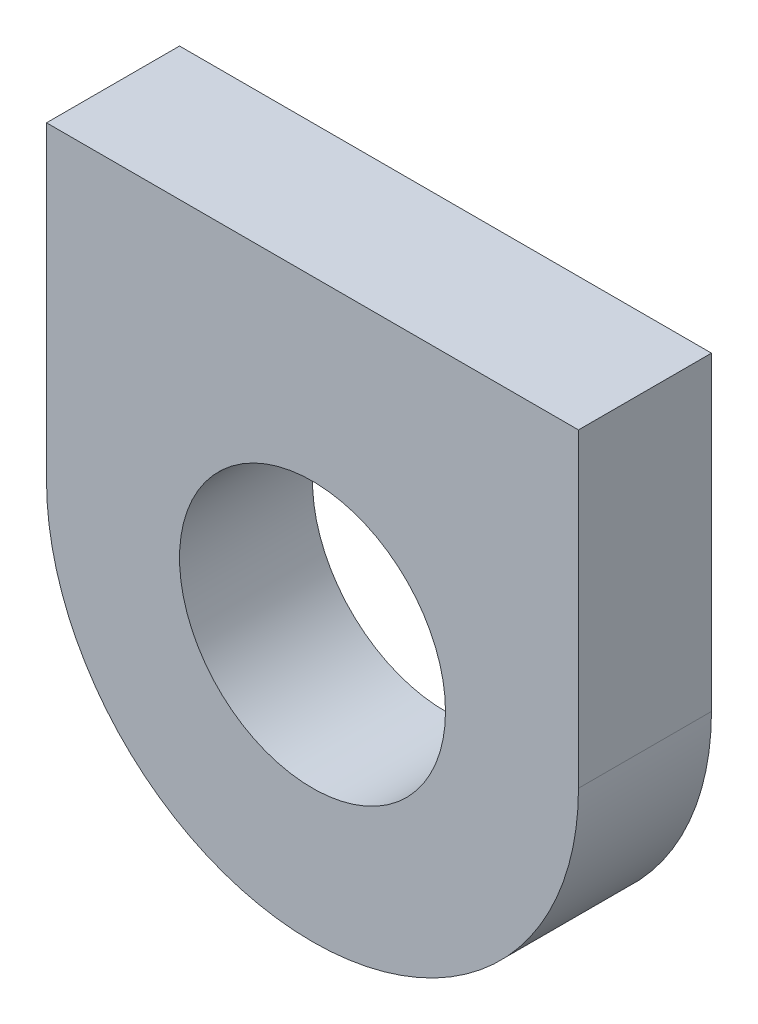
ISO-10303-21;
HEADER;
FILE_DESCRIPTION(('STEP AP214'),'2;1');
FILE_NAME('part.step','',(''),(''),'','','');
FILE_SCHEMA(('AUTOMOTIVE_DESIGN { 1 0 10303 214 1 1 1 1 }'));
ENDSEC;
DATA;
#1=APPLICATION_CONTEXT('core data for automotive mechanical design processes');
#2=APPLICATION_PROTOCOL_DEFINITION('international standard','automotive_design',2000,#1);
#3=PRODUCT_CONTEXT('',#1,'mechanical');
#4=PRODUCT('Part','Part','',(#3));
#5=PRODUCT_RELATED_PRODUCT_CATEGORY('part','',(#4));
#6=PRODUCT_DEFINITION_FORMATION('','',#4);
#7=PRODUCT_DEFINITION_CONTEXT('part definition',#1,'design');
#8=PRODUCT_DEFINITION('design','',#6,#7);
#9=PRODUCT_DEFINITION_SHAPE('','',#8);
#10=(LENGTH_UNIT() NAMED_UNIT(*) SI_UNIT(.MILLI.,.METRE.));
#11=(NAMED_UNIT(*) PLANE_ANGLE_UNIT() SI_UNIT($,.RADIAN.));
#12=(NAMED_UNIT(*) SI_UNIT($,.STERADIAN.) SOLID_ANGLE_UNIT());
#13=UNCERTAINTY_MEASURE_WITH_UNIT(LENGTH_MEASURE(1.E-05),#10,'distance_accuracy_value','');
#14=(GEOMETRIC_REPRESENTATION_CONTEXT(3) GLOBAL_UNCERTAINTY_ASSIGNED_CONTEXT((#13)) GLOBAL_UNIT_ASSIGNED_CONTEXT((#10,
#11,#12)) REPRESENTATION_CONTEXT('',''));
#15=CARTESIAN_POINT('',(0.,0.,0.));
#16=DIRECTION('',(0.,0.,1.));
#17=DIRECTION('',(1.,0.,0.));
#18=AXIS2_PLACEMENT_3D('',#15,#16,#17);
#19=CARTESIAN_POINT('',(0.,0.,15.));
#20=DIRECTION('',(0.,0.,1.));
#21=DIRECTION('',(1.,0.,0.));
#22=AXIS2_PLACEMENT_3D('',#19,#20,#21);
#23=PLANE('',#22);
#24=CARTESIAN_POINT('',(0.,0.,15.));
#25=DIRECTION('',(0.,0.,1.));
#26=DIRECTION('',(1.,0.,0.));
#27=AXIS2_PLACEMENT_3D('',#24,#25,#26);
#28=CIRCLE('',#27,30.);
#29=CARTESIAN_POINT('',(-30.,0.,15.));
#30=VERTEX_POINT('',#29);
#31=CARTESIAN_POINT('',(30.,0.,15.));
#32=VERTEX_POINT('',#31);
#33=EDGE_CURVE('E85',#30,#32,#28,.T.);
#34=ORIENTED_EDGE('',*,*,#33,.T.);
#35=DIRECTION('',(0.,1.,0.));
#36=VECTOR('',#35,1.);
#37=CARTESIAN_POINT('',(30.,35.,15.));
#38=LINE('',#37,#36);
#39=CARTESIAN_POINT('',(30.,35.,15.));
#40=VERTEX_POINT('',#39);
#41=EDGE_CURVE('E80',#32,#40,#38,.T.);
#42=ORIENTED_EDGE('',*,*,#41,.T.);
#43=DIRECTION('',(-1.,0.,0.));
#44=VECTOR('',#43,1.);
#45=CARTESIAN_POINT('',(-30.,35.,15.));
#46=LINE('',#45,#44);
#47=CARTESIAN_POINT('',(-30.,35.,15.));
#48=VERTEX_POINT('',#47);
#49=EDGE_CURVE('E83',#40,#48,#46,.T.);
#50=ORIENTED_EDGE('',*,*,#49,.T.);
#51=DIRECTION('',(0.,-1.,0.));
#52=VECTOR('',#51,1.);
#53=CARTESIAN_POINT('',(-30.,0.,15.));
#54=LINE('',#53,#52);
#55=EDGE_CURVE('E50',#48,#30,#54,.T.);
#56=ORIENTED_EDGE('',*,*,#55,.T.);
#57=EDGE_LOOP('',(#34,#42,#50,#56));
#58=FACE_BOUND('',#57,.T.);
#59=CARTESIAN_POINT('',(0.,0.,15.));
#60=DIRECTION('',(0.,0.,1.));
#61=DIRECTION('',(1.,0.,0.));
#62=AXIS2_PLACEMENT_3D('',#59,#60,#61);
#63=CIRCLE('',#62,15.);
#64=CARTESIAN_POINT('',(15.,0.,15.));
#65=VERTEX_POINT('',#64);
#66=EDGE_CURVE('E100',#65,#65,#63,.T.);
#67=ORIENTED_EDGE('',*,*,#66,.F.);
#68=EDGE_LOOP('',(#67));
#69=FACE_BOUND('',#68,.T.);
#70=ADVANCED_FACE('F33',(#58,#69),#23,.T.);
#71=CARTESIAN_POINT('',(0.,0.,0.));
#72=DIRECTION('',(0.,0.,1.));
#73=DIRECTION('',(1.,0.,0.));
#74=AXIS2_PLACEMENT_3D('',#71,#72,#73);
#75=PLANE('',#74);
#76=CARTESIAN_POINT('',(0.,0.,0.));
#77=DIRECTION('',(0.,0.,1.));
#78=DIRECTION('',(1.,0.,0.));
#79=AXIS2_PLACEMENT_3D('',#76,#77,#78);
#80=CIRCLE('',#79,30.);
#81=CARTESIAN_POINT('',(-30.,0.,0.));
#82=VERTEX_POINT('',#81);
#83=CARTESIAN_POINT('',(30.,0.,0.));
#84=VERTEX_POINT('',#83);
#85=EDGE_CURVE('E97',#82,#84,#80,.T.);
#86=ORIENTED_EDGE('',*,*,#85,.F.);
#87=DIRECTION('',(0.,-1.,0.));
#88=VECTOR('',#87,1.);
#89=CARTESIAN_POINT('',(-30.,0.,0.));
#90=LINE('',#89,#88);
#91=CARTESIAN_POINT('',(-30.,35.,0.));
#92=VERTEX_POINT('',#91);
#93=EDGE_CURVE('E73',#92,#82,#90,.T.);
#94=ORIENTED_EDGE('',*,*,#93,.F.);
#95=DIRECTION('',(-1.,0.,0.));
#96=VECTOR('',#95,1.);
#97=CARTESIAN_POINT('',(-30.,35.,0.));
#98=LINE('',#97,#96);
#99=CARTESIAN_POINT('',(30.,35.,0.));
#100=VERTEX_POINT('',#99);
#101=EDGE_CURVE('E67',#100,#92,#98,.T.);
#102=ORIENTED_EDGE('',*,*,#101,.F.);
#103=DIRECTION('',(0.,1.,0.));
#104=VECTOR('',#103,1.);
#105=CARTESIAN_POINT('',(30.,35.,0.));
#106=LINE('',#105,#104);
#107=EDGE_CURVE('E89',#84,#100,#106,.T.);
#108=ORIENTED_EDGE('',*,*,#107,.F.);
#109=EDGE_LOOP('',(#86,#94,#102,#108));
#110=FACE_BOUND('',#109,.T.);
#111=CARTESIAN_POINT('',(0.,0.,0.));
#112=DIRECTION('',(0.,0.,1.));
#113=DIRECTION('',(1.,0.,0.));
#114=AXIS2_PLACEMENT_3D('',#111,#112,#113);
#115=CIRCLE('',#114,15.);
#116=CARTESIAN_POINT('',(15.,0.,0.));
#117=VERTEX_POINT('',#116);
#118=EDGE_CURVE('E112',#117,#117,#115,.T.);
#119=ORIENTED_EDGE('',*,*,#118,.T.);
#120=EDGE_LOOP('',(#119));
#121=FACE_BOUND('',#120,.T.);
#122=ADVANCED_FACE('F108',(#110,#121),#75,.F.);
#123=CARTESIAN_POINT('',(0.,0.,15.));
#124=DIRECTION('',(0.,0.,-1.));
#125=DIRECTION('',(-1.,0.,0.));
#126=AXIS2_PLACEMENT_3D('',#123,#124,#125);
#127=CYLINDRICAL_SURFACE('',#126,30.);
#128=ORIENTED_EDGE('',*,*,#85,.T.);
#129=DIRECTION('',(0.,0.,-1.));
#130=VECTOR('',#129,1.);
#131=CARTESIAN_POINT('',(30.,0.,15.));
#132=LINE('',#131,#130);
#133=EDGE_CURVE('E11',#32,#84,#132,.T.);
#134=ORIENTED_EDGE('',*,*,#133,.F.);
#135=ORIENTED_EDGE('',*,*,#33,.F.);
#136=DIRECTION('',(0.,0.,-1.));
#137=VECTOR('',#136,1.);
#138=CARTESIAN_POINT('',(-30.,0.,15.));
#139=LINE('',#138,#137);
#140=EDGE_CURVE('E93',#30,#82,#139,.T.);
#141=ORIENTED_EDGE('',*,*,#140,.T.);
#142=EDGE_LOOP('',(#128,#134,#135,#141));
#143=FACE_BOUND('',#142,.T.);
#144=ADVANCED_FACE('F35',(#143),#127,.T.);
#145=CARTESIAN_POINT('',(30.,35.,15.));
#146=DIRECTION('',(-1.,0.,0.));
#147=DIRECTION('',(0.,0.,1.));
#148=AXIS2_PLACEMENT_3D('',#145,#146,#147);
#149=PLANE('',#148);
#150=ORIENTED_EDGE('',*,*,#107,.T.);
#151=DIRECTION('',(0.,0.,-1.));
#152=VECTOR('',#151,1.);
#153=CARTESIAN_POINT('',(30.,35.,15.));
#154=LINE('',#153,#152);
#155=EDGE_CURVE('E42',#40,#100,#154,.T.);
#156=ORIENTED_EDGE('',*,*,#155,.F.);
#157=ORIENTED_EDGE('',*,*,#41,.F.);
#158=ORIENTED_EDGE('',*,*,#133,.T.);
#159=EDGE_LOOP('',(#150,#156,#157,#158));
#160=FACE_BOUND('',#159,.T.);
#161=ADVANCED_FACE('F88',(#160),#149,.F.);
#162=CARTESIAN_POINT('',(-30.,35.,15.));
#163=DIRECTION('',(0.,-1.,0.));
#164=DIRECTION('',(0.,0.,-1.));
#165=AXIS2_PLACEMENT_3D('',#162,#163,#164);
#166=PLANE('',#165);
#167=ORIENTED_EDGE('',*,*,#101,.T.);
#168=DIRECTION('',(0.,0.,-1.));
#169=VECTOR('',#168,1.);
#170=CARTESIAN_POINT('',(-30.,35.,15.));
#171=LINE('',#170,#169);
#172=EDGE_CURVE('E90',#48,#92,#171,.T.);
#173=ORIENTED_EDGE('',*,*,#172,.F.);
#174=ORIENTED_EDGE('',*,*,#49,.F.);
#175=ORIENTED_EDGE('',*,*,#155,.T.);
#176=EDGE_LOOP('',(#167,#173,#174,#175));
#177=FACE_BOUND('',#176,.T.);
#178=ADVANCED_FACE('F91',(#177),#166,.F.);
#179=CARTESIAN_POINT('',(-30.,0.,15.));
#180=DIRECTION('',(1.,0.,0.));
#181=DIRECTION('',(0.,0.,-1.));
#182=AXIS2_PLACEMENT_3D('',#179,#180,#181);
#183=PLANE('',#182);
#184=ORIENTED_EDGE('',*,*,#93,.T.);
#185=ORIENTED_EDGE('',*,*,#140,.F.);
#186=ORIENTED_EDGE('',*,*,#55,.F.);
#187=ORIENTED_EDGE('',*,*,#172,.T.);
#188=EDGE_LOOP('',(#184,#185,#186,#187));
#189=FACE_BOUND('',#188,.T.);
#190=ADVANCED_FACE('F105',(#189),#183,.F.);
#191=CARTESIAN_POINT('',(0.,0.,15.));
#192=DIRECTION('',(0.,0.,-1.));
#193=DIRECTION('',(-1.,0.,0.));
#194=AXIS2_PLACEMENT_3D('',#191,#192,#193);
#195=CYLINDRICAL_SURFACE('',#194,15.);
#196=ORIENTED_EDGE('',*,*,#66,.T.);
#197=EDGE_LOOP('',(#196));
#198=FACE_BOUND('',#197,.T.);
#199=ORIENTED_EDGE('',*,*,#118,.F.);
#200=EDGE_LOOP('',(#199));
#201=FACE_BOUND('',#200,.T.);
#202=ADVANCED_FACE('F118',(#198,#201),#195,.F.);
#203=CLOSED_SHELL('',(#70,#122,#144,#161,#178,#190,#202));
#204=MANIFOLD_SOLID_BREP('B2',#203);
#205=ADVANCED_BREP_SHAPE_REPRESENTATION('',(#18,#204),#14);
#206=SHAPE_DEFINITION_REPRESENTATION(#9,#205);
ENDSEC;
END-ISO-10303-21;
